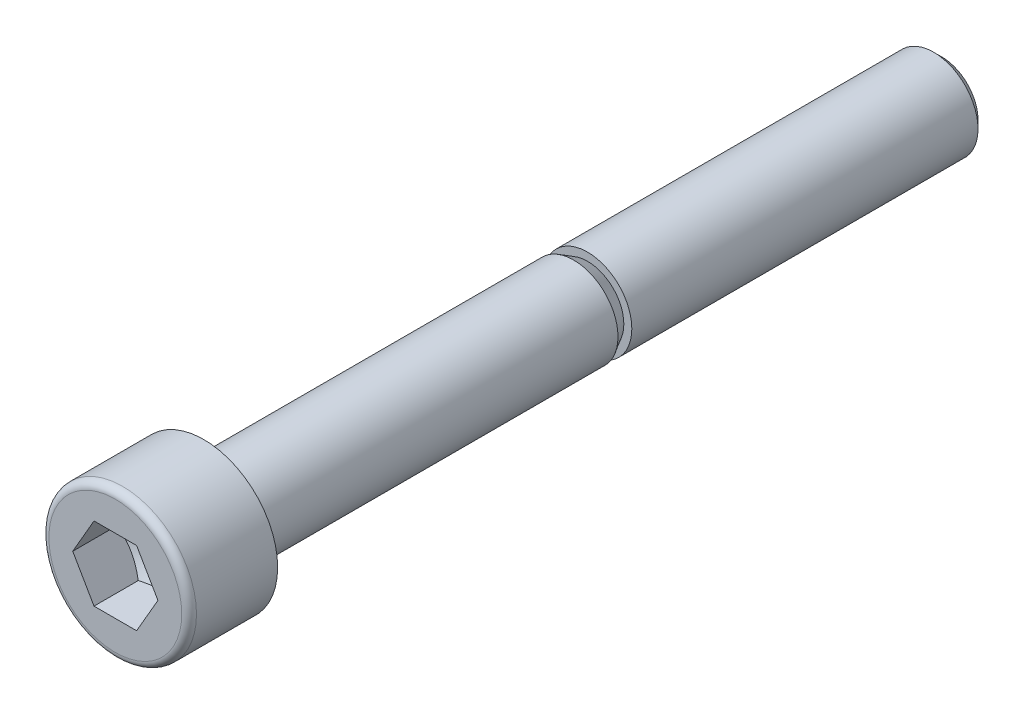
ISO-10303-21;
HEADER;
FILE_DESCRIPTION(('STEP AP214'),'2;1');
FILE_NAME('part.step','',(''),(''),'','','');
FILE_SCHEMA(('AUTOMOTIVE_DESIGN { 1 0 10303 214 1 1 1 1 }'));
ENDSEC;
DATA;
#1=APPLICATION_CONTEXT('core data for automotive mechanical design processes');
#2=APPLICATION_PROTOCOL_DEFINITION('international standard','automotive_design',2000,#1);
#3=PRODUCT_CONTEXT('',#1,'mechanical');
#4=PRODUCT('Part','Part','',(#3));
#5=PRODUCT_RELATED_PRODUCT_CATEGORY('part','',(#4));
#6=PRODUCT_DEFINITION_FORMATION('','',#4);
#7=PRODUCT_DEFINITION_CONTEXT('part definition',#1,'design');
#8=PRODUCT_DEFINITION('design','',#6,#7);
#9=PRODUCT_DEFINITION_SHAPE('','',#8);
#10=(LENGTH_UNIT() NAMED_UNIT(*) SI_UNIT(.MILLI.,.METRE.));
#11=(NAMED_UNIT(*) PLANE_ANGLE_UNIT() SI_UNIT($,.RADIAN.));
#12=(NAMED_UNIT(*) SI_UNIT($,.STERADIAN.) SOLID_ANGLE_UNIT());
#13=UNCERTAINTY_MEASURE_WITH_UNIT(LENGTH_MEASURE(1.E-05),#10,'distance_accuracy_value','');
#14=(GEOMETRIC_REPRESENTATION_CONTEXT(3) GLOBAL_UNCERTAINTY_ASSIGNED_CONTEXT((#13)) GLOBAL_UNIT_ASSIGNED_CONTEXT((#10,
#11,#12)) REPRESENTATION_CONTEXT('',''));
#15=CARTESIAN_POINT('',(0.,0.,0.));
#16=DIRECTION('',(0.,0.,1.));
#17=DIRECTION('',(1.,0.,0.));
#18=AXIS2_PLACEMENT_3D('',#15,#16,#17);
#19=CARTESIAN_POINT('',(0.,0.,6.));
#20=DIRECTION('',(0.,0.,1.));
#21=DIRECTION('',(1.,0.,0.));
#22=AXIS2_PLACEMENT_3D('',#19,#20,#21);
#23=PLANE('',#22);
#24=CARTESIAN_POINT('',(0.,0.,6.));
#25=DIRECTION('',(0.,0.,1.));
#26=DIRECTION('',(1.,0.,0.));
#27=AXIS2_PLACEMENT_3D('',#24,#25,#26);
#28=CIRCLE('',#27,4.5);
#29=CARTESIAN_POINT('',(4.5,0.,6.));
#30=VERTEX_POINT('',#29);
#31=EDGE_CURVE('E11',#30,#30,#28,.T.);
#32=ORIENTED_EDGE('',*,*,#31,.T.);
#33=EDGE_LOOP('',(#32));
#34=FACE_BOUND('',#33,.T.);
#35=DIRECTION('',(1.,0.,0.));
#36=VECTOR('',#35,1.);
#37=CARTESIAN_POINT('',(-1.443375,2.49999883437473,6.));
#38=LINE('',#37,#36);
#39=CARTESIAN_POINT('',(-1.443375,2.49999883437473,6.));
#40=VERTEX_POINT('',#39);
#41=CARTESIAN_POINT('',(1.443375,2.49999883437473,6.));
#42=VERTEX_POINT('',#41);
#43=EDGE_CURVE('E92',#40,#42,#38,.T.);
#44=ORIENTED_EDGE('',*,*,#43,.T.);
#45=DIRECTION('',(0.5,-0.866025403784439,0.));
#46=VECTOR('',#45,1.);
#47=CARTESIAN_POINT('',(1.443375,2.49999883437473,6.));
#48=LINE('',#47,#46);
#49=CARTESIAN_POINT('',(2.88675,0.,6.));
#50=VERTEX_POINT('',#49);
#51=EDGE_CURVE('E31',#42,#50,#48,.T.);
#52=ORIENTED_EDGE('',*,*,#51,.T.);
#53=DIRECTION('',(-0.5,-0.866025403784439,0.));
#54=VECTOR('',#53,1.);
#55=CARTESIAN_POINT('',(2.88675,0.,6.));
#56=LINE('',#55,#54);
#57=CARTESIAN_POINT('',(1.443375,-2.49999883437473,6.));
#58=VERTEX_POINT('',#57);
#59=EDGE_CURVE('E169',#50,#58,#56,.T.);
#60=ORIENTED_EDGE('',*,*,#59,.T.);
#61=DIRECTION('',(-1.,0.,0.));
#62=VECTOR('',#61,1.);
#63=CARTESIAN_POINT('',(1.443375,-2.49999883437473,6.));
#64=LINE('',#63,#62);
#65=CARTESIAN_POINT('',(-1.443375,-2.49999883437473,6.));
#66=VERTEX_POINT('',#65);
#67=EDGE_CURVE('E165',#58,#66,#64,.T.);
#68=ORIENTED_EDGE('',*,*,#67,.T.);
#69=DIRECTION('',(-0.5,0.866025403784439,0.));
#70=VECTOR('',#69,1.);
#71=CARTESIAN_POINT('',(-1.443375,-2.49999883437473,6.));
#72=LINE('',#71,#70);
#73=CARTESIAN_POINT('',(-2.88675,0.,6.));
#74=VERTEX_POINT('',#73);
#75=EDGE_CURVE('E160',#66,#74,#72,.T.);
#76=ORIENTED_EDGE('',*,*,#75,.T.);
#77=DIRECTION('',(0.5,0.866025403784439,0.));
#78=VECTOR('',#77,1.);
#79=CARTESIAN_POINT('',(-2.88675,0.,6.));
#80=LINE('',#79,#78);
#81=EDGE_CURVE('E96',#74,#40,#80,.T.);
#82=ORIENTED_EDGE('',*,*,#81,.T.);
#83=EDGE_LOOP('',(#44,#52,#60,#68,#76,#82));
#84=FACE_BOUND('',#83,.T.);
#85=ADVANCED_FACE('F17',(#34,#84),#23,.T.);
#86=CARTESIAN_POINT('',(0.,0.,5.5));
#87=DIRECTION('',(0.,0.,1.));
#88=DIRECTION('',(1.,0.,0.));
#89=AXIS2_PLACEMENT_3D('',#86,#87,#88);
#90=TOROIDAL_SURFACE('',#89,4.5,0.5);
#91=ORIENTED_EDGE('',*,*,#31,.F.);
#92=EDGE_LOOP('',(#91));
#93=FACE_BOUND('',#92,.T.);
#94=CARTESIAN_POINT('',(0.,0.,5.5));
#95=DIRECTION('',(0.,0.,1.));
#96=DIRECTION('',(1.,0.,0.));
#97=AXIS2_PLACEMENT_3D('',#94,#95,#96);
#98=CIRCLE('',#97,5.);
#99=CARTESIAN_POINT('',(5.,0.,5.5));
#100=VERTEX_POINT('',#99);
#101=EDGE_CURVE('E24',#100,#100,#98,.T.);
#102=ORIENTED_EDGE('',*,*,#101,.T.);
#103=EDGE_LOOP('',(#102));
#104=FACE_BOUND('',#103,.T.);
#105=ADVANCED_FACE('F133',(#93,#104),#90,.T.);
#106=CARTESIAN_POINT('',(0.,0.,6.));
#107=DIRECTION('',(0.,0.,1.));
#108=DIRECTION('',(1.,0.,0.));
#109=AXIS2_PLACEMENT_3D('',#106,#107,#108);
#110=CYLINDRICAL_SURFACE('',#109,5.);
#111=CARTESIAN_POINT('',(0.,0.,0.));
#112=DIRECTION('',(0.,0.,1.));
#113=DIRECTION('',(1.,0.,0.));
#114=AXIS2_PLACEMENT_3D('',#111,#112,#113);
#115=CIRCLE('',#114,5.);
#116=CARTESIAN_POINT('',(5.,0.,0.));
#117=VERTEX_POINT('',#116);
#118=EDGE_CURVE('E128',#117,#117,#115,.T.);
#119=ORIENTED_EDGE('',*,*,#118,.T.);
#120=EDGE_LOOP('',(#119));
#121=FACE_BOUND('',#120,.T.);
#122=ORIENTED_EDGE('',*,*,#101,.F.);
#123=EDGE_LOOP('',(#122));
#124=FACE_BOUND('',#123,.T.);
#125=ADVANCED_FACE('F135',(#121,#124),#110,.T.);
#126=CARTESIAN_POINT('',(0.,5.,0.));
#127=DIRECTION('',(0.,0.,-1.));
#128=DIRECTION('',(-1.,0.,0.));
#129=AXIS2_PLACEMENT_3D('',#126,#127,#128);
#130=PLANE('',#129);
#131=CARTESIAN_POINT('',(0.,0.,0.));
#132=DIRECTION('',(0.,0.,1.));
#133=DIRECTION('',(1.,0.,0.));
#134=AXIS2_PLACEMENT_3D('',#131,#132,#133);
#135=CIRCLE('',#134,3.3);
#136=CARTESIAN_POINT('',(3.3,0.,0.));
#137=VERTEX_POINT('',#136);
#138=EDGE_CURVE('E125',#137,#137,#135,.T.);
#139=ORIENTED_EDGE('',*,*,#138,.T.);
#140=EDGE_LOOP('',(#139));
#141=FACE_BOUND('',#140,.T.);
#142=ORIENTED_EDGE('',*,*,#118,.F.);
#143=EDGE_LOOP('',(#142));
#144=FACE_BOUND('',#143,.T.);
#145=ADVANCED_FACE('F137',(#141,#144),#130,.T.);
#146=CARTESIAN_POINT('',(0.,0.,-0.3));
#147=DIRECTION('',(0.,0.,1.));
#148=DIRECTION('',(1.,0.,0.));
#149=AXIS2_PLACEMENT_3D('',#146,#147,#148);
#150=TOROIDAL_SURFACE('',#149,3.3,0.3);
#151=CARTESIAN_POINT('',(0.,0.,-0.3));
#152=DIRECTION('',(0.,0.,1.));
#153=DIRECTION('',(1.,0.,0.));
#154=AXIS2_PLACEMENT_3D('',#151,#152,#153);
#155=CIRCLE('',#154,3.);
#156=CARTESIAN_POINT('',(3.,0.,-0.3));
#157=VERTEX_POINT('',#156);
#158=EDGE_CURVE('E122',#157,#157,#155,.T.);
#159=ORIENTED_EDGE('',*,*,#158,.T.);
#160=EDGE_LOOP('',(#159));
#161=FACE_BOUND('',#160,.T.);
#162=ORIENTED_EDGE('',*,*,#138,.F.);
#163=EDGE_LOOP('',(#162));
#164=FACE_BOUND('',#163,.T.);
#165=ADVANCED_FACE('F145',(#161,#164),#150,.F.);
#166=CARTESIAN_POINT('',(0.,0.,6.));
#167=DIRECTION('',(0.,0.,1.));
#168=DIRECTION('',(1.,0.,0.));
#169=AXIS2_PLACEMENT_3D('',#166,#167,#168);
#170=CYLINDRICAL_SURFACE('',#169,3.);
#171=CARTESIAN_POINT('',(0.,0.,-25.0625275004034));
#172=DIRECTION('',(0.,0.,1.));
#173=DIRECTION('',(1.,0.,0.));
#174=AXIS2_PLACEMENT_3D('',#171,#172,#173);
#175=CIRCLE('',#174,3.);
#176=CARTESIAN_POINT('',(3.,0.,-25.0625275004034));
#177=VERTEX_POINT('',#176);
#178=EDGE_CURVE('E119',#177,#177,#175,.T.);
#179=ORIENTED_EDGE('',*,*,#178,.T.);
#180=EDGE_LOOP('',(#179));
#181=FACE_BOUND('',#180,.T.);
#182=ORIENTED_EDGE('',*,*,#158,.F.);
#183=EDGE_LOOP('',(#182));
#184=FACE_BOUND('',#183,.T.);
#185=ADVANCED_FACE('F346',(#181,#184),#170,.T.);
#186=CARTESIAN_POINT('',(0.,0.,-25.0625275004034));
#187=DIRECTION('',(0.,0.,1.));
#188=DIRECTION('',(1.,0.,0.));
#189=AXIS2_PLACEMENT_3D('',#186,#187,#188);
#190=CONICAL_SURFACE('',#189,3.,0.523598775598299);
#191=CARTESIAN_POINT('',(0.,0.,-26.));
#192=DIRECTION('',(0.,0.,1.));
#193=DIRECTION('',(1.,0.,0.));
#194=AXIS2_PLACEMENT_3D('',#191,#192,#193);
#195=CIRCLE('',#194,2.45875);
#196=CARTESIAN_POINT('',(2.45875,0.,-26.));
#197=VERTEX_POINT('',#196);
#198=EDGE_CURVE('E116',#197,#197,#195,.T.);
#199=ORIENTED_EDGE('',*,*,#198,.T.);
#200=EDGE_LOOP('',(#199));
#201=FACE_BOUND('',#200,.T.);
#202=ORIENTED_EDGE('',*,*,#178,.F.);
#203=EDGE_LOOP('',(#202));
#204=FACE_BOUND('',#203,.T.);
#205=ADVANCED_FACE('F337',(#201,#204),#190,.T.);
#206=CARTESIAN_POINT('',(0.,2.45875,-26.));
#207=DIRECTION('',(0.,0.,1.));
#208=DIRECTION('',(1.,0.,0.));
#209=AXIS2_PLACEMENT_3D('',#206,#207,#208);
#210=PLANE('',#209);
#211=CARTESIAN_POINT('',(0.,0.,-26.));
#212=DIRECTION('',(0.,0.,1.));
#213=DIRECTION('',(1.,0.,0.));
#214=AXIS2_PLACEMENT_3D('',#211,#212,#213);
#215=CIRCLE('',#214,3.);
#216=CARTESIAN_POINT('',(3.,0.,-26.));
#217=VERTEX_POINT('',#216);
#218=EDGE_CURVE('E113',#217,#217,#215,.T.);
#219=ORIENTED_EDGE('',*,*,#218,.T.);
#220=EDGE_LOOP('',(#219));
#221=FACE_BOUND('',#220,.T.);
#222=ORIENTED_EDGE('',*,*,#198,.F.);
#223=EDGE_LOOP('',(#222));
#224=FACE_BOUND('',#223,.T.);
#225=ADVANCED_FACE('F322',(#221,#224),#210,.T.);
#226=CARTESIAN_POINT('',(0.,0.,6.));
#227=DIRECTION('',(0.,0.,1.));
#228=DIRECTION('',(1.,0.,0.));
#229=AXIS2_PLACEMENT_3D('',#226,#227,#228);
#230=CYLINDRICAL_SURFACE('',#229,3.);
#231=CARTESIAN_POINT('',(0.,0.,-49.45875));
#232=DIRECTION('',(0.,0.,1.));
#233=DIRECTION('',(1.,0.,0.));
#234=AXIS2_PLACEMENT_3D('',#231,#232,#233);
#235=CIRCLE('',#234,3.);
#236=CARTESIAN_POINT('',(3.,0.,-49.45875));
#237=VERTEX_POINT('',#236);
#238=EDGE_CURVE('E110',#237,#237,#235,.T.);
#239=ORIENTED_EDGE('',*,*,#238,.T.);
#240=EDGE_LOOP('',(#239));
#241=FACE_BOUND('',#240,.T.);
#242=ORIENTED_EDGE('',*,*,#218,.F.);
#243=EDGE_LOOP('',(#242));
#244=FACE_BOUND('',#243,.T.);
#245=ADVANCED_FACE('F311',(#241,#244),#230,.T.);
#246=CARTESIAN_POINT('',(0.,0.,-49.45875));
#247=DIRECTION('',(0.,0.,1.));
#248=DIRECTION('',(1.,0.,0.));
#249=AXIS2_PLACEMENT_3D('',#246,#247,#248);
#250=CONICAL_SURFACE('',#249,3.,0.78539816339745);
#251=CARTESIAN_POINT('',(0.,0.,-50.));
#252=DIRECTION('',(0.,0.,1.));
#253=DIRECTION('',(1.,0.,0.));
#254=AXIS2_PLACEMENT_3D('',#251,#252,#253);
#255=CIRCLE('',#254,2.45875);
#256=CARTESIAN_POINT('',(2.45875,0.,-50.));
#257=VERTEX_POINT('',#256);
#258=EDGE_CURVE('E107',#257,#257,#255,.T.);
#259=ORIENTED_EDGE('',*,*,#258,.T.);
#260=EDGE_LOOP('',(#259));
#261=FACE_BOUND('',#260,.T.);
#262=ORIENTED_EDGE('',*,*,#238,.F.);
#263=EDGE_LOOP('',(#262));
#264=FACE_BOUND('',#263,.T.);
#265=ADVANCED_FACE('F303',(#261,#264),#250,.T.);
#266=CARTESIAN_POINT('',(0.,2.45875,-50.));
#267=DIRECTION('',(0.,0.,-1.));
#268=DIRECTION('',(-1.,0.,0.));
#269=AXIS2_PLACEMENT_3D('',#266,#267,#268);
#270=PLANE('',#269);
#271=ORIENTED_EDGE('',*,*,#258,.F.);
#272=EDGE_LOOP('',(#271));
#273=FACE_BOUND('',#272,.T.);
#274=ADVANCED_FACE('F225',(#273),#270,.T.);
#275=CARTESIAN_POINT('',(1.443375,2.49999883437473,1.33333411041685));
#276=DIRECTION('',(-0.866025403784439,-0.5,0.));
#277=DIRECTION('',(-0.5,0.866025403784439,0.));
#278=AXIS2_PLACEMENT_3D('',#275,#276,#277);
#279=PLANE('',#278);
#280=DIRECTION('',(0.,0.,1.));
#281=VECTOR('',#280,1.);
#282=CARTESIAN_POINT('',(2.88675,0.,1.33333411041685));
#283=LINE('',#282,#281);
#284=CARTESIAN_POINT('',(2.88675,0.,3.));
#285=VERTEX_POINT('',#284);
#286=EDGE_CURVE('E105',#285,#50,#283,.T.);
#287=ORIENTED_EDGE('',*,*,#286,.T.);
#288=ORIENTED_EDGE('',*,*,#51,.F.);
#289=DIRECTION('',(0.,0.,1.));
#290=VECTOR('',#289,1.);
#291=CARTESIAN_POINT('',(1.443375,2.49999883437473,1.33333411041685));
#292=LINE('',#291,#290);
#293=CARTESIAN_POINT('',(1.443375,2.49999883437473,3.));
#294=VERTEX_POINT('',#293);
#295=EDGE_CURVE('E86',#294,#42,#292,.T.);
#296=ORIENTED_EDGE('',*,*,#295,.F.);
#297=CARTESIAN_POINT('',(2.88675011547006,-1.99999999863357E-07,3.00000006666667));
#298=CARTESIAN_POINT('',(2.82332252366581,0.10985961160669,2.96336950967828));
#299=CARTESIAN_POINT('',(2.75934742579574,0.220667731536841,2.93005593436152));
#300=CARTESIAN_POINT('',(2.63028954387127,0.444202540147256,2.87190808727666));
#301=CARTESIAN_POINT('',(2.56520446745334,0.556933199317605,2.84709438377072));
#302=CARTESIAN_POINT('',(2.43584088140159,0.780997503008549,2.80847006268835));
#303=CARTESIAN_POINT('',(2.37158227044588,0.892296682007636,2.7944023489199));
#304=CARTESIAN_POINT('',(2.24276284805613,1.11541846658835,2.77761157054617));
#305=CARTESIAN_POINT('',(2.17820250452486,1.22724026173863,2.77487459839365));
#306=CARTESIAN_POINT('',(2.05757841328359,1.43616731638533,2.78058295689796));
#307=CARTESIAN_POINT('',(2.00149656500914,1.53330392697905,2.7876266963322));
#308=CARTESIAN_POINT('',(1.8896982234341,1.72694433478895,2.80994670830941));
#309=CARTESIAN_POINT('',(1.83398211652594,1.82344746275382,2.82523059787334));
#310=CARTESIAN_POINT('',(1.72195345954662,2.01748678854571,2.86343736615338));
#311=CARTESIAN_POINT('',(1.66565508107193,2.11499844044762,2.88652212541071));
#312=CARTESIAN_POINT('',(1.55389777191142,2.3085677780308,2.93891477048972));
#313=CARTESIAN_POINT('',(1.49843741058811,2.40462794164891,2.96821035401504));
#314=CARTESIAN_POINT('',(1.44337488452994,2.49999903437473,3.00000006666667));
#315=B_SPLINE_CURVE_WITH_KNOTS('',3,(#297,#298,#299,#300,#301,#302,#303,#304,#305,#306,#307,
#308,#309,#310,#311,#312,#313,#314),.UNSPECIFIED.,.F.,.F.,(4,2,2,2,2,2,2,2,4),(0.,
0.396269845497158,0.793491933375094,1.18088400346178,1.56780044062153,1.90463400294076,
2.24177946228527,2.58640119548574,2.93034658115087),.UNSPECIFIED.);
#316=EDGE_CURVE('E79',#285,#294,#315,.T.);
#317=ORIENTED_EDGE('',*,*,#316,.F.);
#318=EDGE_LOOP('',(#287,#288,#296,#317));
#319=FACE_BOUND('',#318,.T.);
#320=ADVANCED_FACE('F87',(#319),#279,.T.);
#321=CARTESIAN_POINT('',(2.88675,0.,1.33333411041685));
#322=DIRECTION('',(-0.866025403784439,0.5,0.));
#323=DIRECTION('',(0.5,0.866025403784439,0.));
#324=AXIS2_PLACEMENT_3D('',#321,#322,#323);
#325=PLANE('',#324);
#326=DIRECTION('',(0.,0.,1.));
#327=VECTOR('',#326,1.);
#328=CARTESIAN_POINT('',(1.443375,-2.49999883437473,1.33333411041685));
#329=LINE('',#328,#327);
#330=CARTESIAN_POINT('',(1.443375,-2.49999883437473,3.));
#331=VERTEX_POINT('',#330);
#332=EDGE_CURVE('E103',#331,#58,#329,.T.);
#333=ORIENTED_EDGE('',*,*,#332,.T.);
#334=ORIENTED_EDGE('',*,*,#59,.F.);
#335=ORIENTED_EDGE('',*,*,#286,.F.);
#336=CARTESIAN_POINT('',(1.44337488452995,-2.49999903437473,3.00000006666667));
#337=CARTESIAN_POINT('',(1.50680247633419,-2.39013922276804,2.96336950967828));
#338=CARTESIAN_POINT('',(1.57077757420426,-2.27933110283789,2.93005593436152));
#339=CARTESIAN_POINT('',(1.69983545612873,-2.05579629422747,2.87190808727666));
#340=CARTESIAN_POINT('',(1.76492053254666,-1.94306563505712,2.84709438377072));
#341=CARTESIAN_POINT('',(1.89428411859841,-1.71900133136618,2.80847006268835));
#342=CARTESIAN_POINT('',(1.95854272955412,-1.60770215236709,2.7944023489199));
#343=CARTESIAN_POINT('',(2.08736215194387,-1.38458036778637,2.77761157054617));
#344=CARTESIAN_POINT('',(2.15192249547514,-1.2727585726361,2.77487459839365));
#345=CARTESIAN_POINT('',(2.27254658671641,-1.06383151798939,2.78058295689796));
#346=CARTESIAN_POINT('',(2.32862843499086,-0.96669490739568,2.7876266963322));
#347=CARTESIAN_POINT('',(2.4404267765659,-0.773054499585779,2.8099467083094));
#348=CARTESIAN_POINT('',(2.49614288347406,-0.676551371620907,2.82523059787334));
#349=CARTESIAN_POINT('',(2.60817154045338,-0.48251204582902,2.86343736615338));
#350=CARTESIAN_POINT('',(2.66446991892807,-0.385000393927105,2.88652212541071));
#351=CARTESIAN_POINT('',(2.77622722808858,-0.191431056343928,2.93891477048972));
#352=CARTESIAN_POINT('',(2.83168758941189,-0.0953708927258217,2.96821035401504));
#353=CARTESIAN_POINT('',(2.88675011547006,1.99999999976406E-07,3.00000006666667));
#354=B_SPLINE_CURVE_WITH_KNOTS('',3,(#336,#337,#338,#339,#340,#341,#342,#343,#344,#345,#346,
#347,#348,#349,#350,#351,#352,#353),.UNSPECIFIED.,.F.,.F.,(4,2,2,2,2,2,2,2,4),(0.,
0.396269845497159,0.793491933375095,1.18088400346178,1.56780044062153,1.90463400294076,
2.24177946228527,2.58640119548574,2.93034658115087),.UNSPECIFIED.);
#355=EDGE_CURVE('E83',#331,#285,#354,.T.);
#356=ORIENTED_EDGE('',*,*,#355,.F.);
#357=EDGE_LOOP('',(#333,#334,#335,#356));
#358=FACE_BOUND('',#357,.T.);
#359=ADVANCED_FACE('F216',(#358),#325,.T.);
#360=CARTESIAN_POINT('',(1.443375,-2.49999883437473,1.33333411041685));
#361=DIRECTION('',(0.,1.,0.));
#362=DIRECTION('',(1.,0.,0.));
#363=AXIS2_PLACEMENT_3D('',#360,#361,#362);
#364=PLANE('',#363);
#365=DIRECTION('',(0.,0.,1.));
#366=VECTOR('',#365,1.);
#367=CARTESIAN_POINT('',(-1.443375,-2.49999883437473,1.33333411041685));
#368=LINE('',#367,#366);
#369=CARTESIAN_POINT('',(-1.443375,-2.49999883437473,3.));
#370=VERTEX_POINT('',#369);
#371=EDGE_CURVE('E101',#370,#66,#368,.T.);
#372=ORIENTED_EDGE('',*,*,#371,.T.);
#373=ORIENTED_EDGE('',*,*,#67,.F.);
#374=ORIENTED_EDGE('',*,*,#332,.F.);
#375=CARTESIAN_POINT('',(-3.73786106214978,-2.49999883437473,3.92958778907324));
#376=CARTESIAN_POINT('',(-3.62896491195938,-2.49999883437473,3.87734398831161));
#377=CARTESIAN_POINT('',(-3.51980131110672,-2.49999883437473,3.82564701620672));
#378=CARTESIAN_POINT('',(-3.30079453275696,-2.49999883437473,3.72366066581967));
#379=CARTESIAN_POINT('',(-3.19095123199839,-2.49999883437473,3.67337155256083));
#380=CARTESIAN_POINT('',(-2.96980741137606,-2.49999883437473,3.57423266172552));
#381=CARTESIAN_POINT('',(-2.85850208851781,-2.49999883437473,3.5253935570836));
#382=CARTESIAN_POINT('',(-2.63494533066189,-2.49999883437473,3.42993961665011));
#383=CARTESIAN_POINT('',(-2.52269394848717,-2.49999883437473,3.38332465762953));
#384=CARTESIAN_POINT('',(-2.2960796228752,-2.49999883437473,3.29252281771904));
#385=CARTESIAN_POINT('',(-2.18170681392527,-2.49999883437473,3.2483604168365));
#386=CARTESIAN_POINT('',(-1.95158478593381,-2.49999883437473,3.16370836718421));
#387=CARTESIAN_POINT('',(-1.83583541308941,-2.49999883437473,3.12321913326025));
#388=CARTESIAN_POINT('',(-1.60304799958039,-2.49999883437473,3.04706130714345));
#389=CARTESIAN_POINT('',(-1.4860136544433,-2.49999883437473,3.01138153954989));
#390=CARTESIAN_POINT('',(-1.25028155584969,-2.49999883437473,2.94604587235114));
#391=CARTESIAN_POINT('',(-1.13158421230429,-2.49999883437473,2.91638851527048));
#392=CARTESIAN_POINT('',(-0.892146141983619,-2.49999883437473,2.86451911091829));
#393=CARTESIAN_POINT('',(-0.771400115486069,-2.49999883437473,2.84233105195638));
#394=CARTESIAN_POINT('',(-0.528550538126974,-2.49999883437473,2.8070567548414));
#395=CARTESIAN_POINT('',(-0.406446967923683,-2.49999883437473,2.7939706465386));
#396=CARTESIAN_POINT('',(-0.162227421037293,-2.49999883437473,2.77805851853028));
#397=CARTESIAN_POINT('',(-0.0401151733531879,-2.49999883437473,2.77517671003708));
#398=CARTESIAN_POINT('',(0.203885891243259,-2.49999883437473,2.77978959871521));
#399=CARTESIAN_POINT('',(0.325774751512606,-2.49999883437473,2.78728200631532));
#400=CARTESIAN_POINT('',(0.536617165080476,-2.49999883437473,2.80870547357712));
#401=CARTESIAN_POINT('',(0.625806204585235,-2.49999883437473,2.82042640123085));
#402=CARTESIAN_POINT('',(0.803437024790562,-2.49999883437473,2.84861382064688));
#403=CARTESIAN_POINT('',(0.891878680031716,-2.49999883437473,2.86508109348135));
#404=CARTESIAN_POINT('',(1.1562492807378,-2.49999883437473,2.92077504184743));
#405=CARTESIAN_POINT('',(1.3308708069745,-2.49999883437473,2.96625356320288));
#406=CARTESIAN_POINT('',(1.59190160301469,-2.49999883437473,3.04393162478608));
#407=CARTESIAN_POINT('',(1.67969059973094,-2.49999883437473,3.0717495689676));
#408=CARTESIAN_POINT('',(1.85442096143946,-2.49999883437473,3.12997740734101));
#409=CARTESIAN_POINT('',(1.94136225311569,-2.49999883437473,3.16038752354637));
#410=CARTESIAN_POINT('',(2.1139610250156,-2.49999883437473,3.22316216485984));
#411=CARTESIAN_POINT('',(2.19962301770649,-2.49999883437473,3.25551440549188));
#412=CARTESIAN_POINT('',(2.37023194830679,-2.49999883437473,3.32197432045096));
#413=CARTESIAN_POINT('',(2.45517911361762,-2.49999883437473,3.35608140990558));
#414=CARTESIAN_POINT('',(2.53982745281954,-2.49999883437473,3.3908988248281));
#415=B_SPLINE_CURVE_WITH_KNOTS('',3,(#375,#376,#377,#378,#379,#380,#381,#382,#383,#384,#385,
#386,#387,#388,#389,#390,#391,#392,#393,#394,#395,#396,#397,#398,#399,#400,#401,#402,#403,#404,
#405,#406,#407,#408,#409,#410,#411,#412,#413,#414),.UNSPECIFIED.,.F.,.F.,(4,2,2,2,2,2,2,2,2,2,2,
2,2,2,2,2,2,2,2,4),(0.,0.362345077461351,0.724757912306451,1.08938530048732,1.45399246293536,
1.82175226930555,2.18955355872751,2.55648491480033,2.92332736420018,3.29133696448628,
3.65935181476395,4.02535152666688,4.39127047595122,4.66100477488141,4.93078348742953,
5.47140222651042,5.74765583222639,6.02393312223645,6.29861688003657,6.57320967433308),.UNSPECIFIED.);
#416=EDGE_CURVE('E207',#370,#331,#415,.T.);
#417=ORIENTED_EDGE('',*,*,#416,.F.);
#418=EDGE_LOOP('',(#372,#373,#374,#417));
#419=FACE_BOUND('',#418,.T.);
#420=ADVANCED_FACE('F212',(#419),#364,.T.);
#421=CARTESIAN_POINT('',(-1.443375,-2.49999883437473,1.33333411041685));
#422=DIRECTION('',(0.866025403784439,0.5,0.));
#423=DIRECTION('',(0.5,-0.866025403784439,0.));
#424=AXIS2_PLACEMENT_3D('',#421,#422,#423);
#425=PLANE('',#424);
#426=DIRECTION('',(0.,0.,1.));
#427=VECTOR('',#426,1.);
#428=CARTESIAN_POINT('',(-2.88675,0.,1.33333411041685));
#429=LINE('',#428,#427);
#430=CARTESIAN_POINT('',(-2.88675,0.,3.));
#431=VERTEX_POINT('',#430);
#432=EDGE_CURVE('E94',#431,#74,#429,.T.);
#433=ORIENTED_EDGE('',*,*,#432,.T.);
#434=ORIENTED_EDGE('',*,*,#75,.F.);
#435=ORIENTED_EDGE('',*,*,#371,.F.);
#436=CARTESIAN_POINT('',(-2.88675011547006,2.E-07,3.00000006666667));
#437=CARTESIAN_POINT('',(-2.82332252366581,-0.109859611606689,2.96336950967828));
#438=CARTESIAN_POINT('',(-2.75934742579574,-0.220667731536841,2.93005593436152));
#439=CARTESIAN_POINT('',(-2.63028954387127,-0.444202540147256,2.87190808727666));
#440=CARTESIAN_POINT('',(-2.56520446745334,-0.556933199317605,2.84709438377072));
#441=CARTESIAN_POINT('',(-2.43584088140159,-0.78099750300855,2.80847006268835));
#442=CARTESIAN_POINT('',(-2.37158227044588,-0.892296682007636,2.7944023489199));
#443=CARTESIAN_POINT('',(-2.24276284805613,-1.11541846658835,2.77761157054617));
#444=CARTESIAN_POINT('',(-2.17820250452486,-1.22724026173863,2.77487459839365));
#445=CARTESIAN_POINT('',(-2.05757841328359,-1.43616731638533,2.78058295689796));
#446=CARTESIAN_POINT('',(-2.00149656500914,-1.53330392697905,2.7876266963322));
#447=CARTESIAN_POINT('',(-1.8896982234341,-1.72694433478895,2.80994670830941));
#448=CARTESIAN_POINT('',(-1.83398211652594,-1.82344746275382,2.82523059787334));
#449=CARTESIAN_POINT('',(-1.72195345954662,-2.01748678854571,2.86343736615338));
#450=CARTESIAN_POINT('',(-1.66565508107193,-2.11499844044762,2.88652212541071));
#451=CARTESIAN_POINT('',(-1.55389777191142,-2.3085677780308,2.93891477048972));
#452=CARTESIAN_POINT('',(-1.49843741058811,-2.40462794164891,2.96821035401504));
#453=CARTESIAN_POINT('',(-1.44337488452995,-2.49999903437473,3.00000006666667));
#454=B_SPLINE_CURVE_WITH_KNOTS('',3,(#436,#437,#438,#439,#440,#441,#442,#443,#444,#445,#446,
#447,#448,#449,#450,#451,#452,#453),.UNSPECIFIED.,.F.,.F.,(4,2,2,2,2,2,2,2,4),(0.,
0.396269845497158,0.793491933375094,1.18088400346178,1.56780044062153,1.90463400294076,
2.24177946228527,2.58640119548574,2.93034658115087),.UNSPECIFIED.);
#455=EDGE_CURVE('E202',#431,#370,#454,.T.);
#456=ORIENTED_EDGE('',*,*,#455,.F.);
#457=EDGE_LOOP('',(#433,#434,#435,#456));
#458=FACE_BOUND('',#457,.T.);
#459=ADVANCED_FACE('F215',(#458),#425,.T.);
#460=CARTESIAN_POINT('',(-2.88675,0.,1.33333411041685));
#461=DIRECTION('',(0.866025403784439,-0.5,0.));
#462=DIRECTION('',(-0.5,-0.866025403784439,0.));
#463=AXIS2_PLACEMENT_3D('',#460,#461,#462);
#464=PLANE('',#463);
#465=DIRECTION('',(0.,0.,1.));
#466=VECTOR('',#465,1.);
#467=CARTESIAN_POINT('',(-1.443375,2.49999883437473,1.33333411041685));
#468=LINE('',#467,#466);
#469=CARTESIAN_POINT('',(-1.443375,2.49999883437473,3.));
#470=VERTEX_POINT('',#469);
#471=EDGE_CURVE('E91',#470,#40,#468,.T.);
#472=ORIENTED_EDGE('',*,*,#471,.T.);
#473=ORIENTED_EDGE('',*,*,#81,.F.);
#474=ORIENTED_EDGE('',*,*,#432,.F.);
#475=CARTESIAN_POINT('',(-1.44337488452995,2.49999903437473,3.00000006666667));
#476=CARTESIAN_POINT('',(-1.50680247633419,2.39013922276804,2.96336950967828));
#477=CARTESIAN_POINT('',(-1.57077757420426,2.27933110283789,2.93005593436152));
#478=CARTESIAN_POINT('',(-1.69983545612874,2.05579629422747,2.87190808727665));
#479=CARTESIAN_POINT('',(-1.76492053254666,1.94306563505712,2.84709438377072));
#480=CARTESIAN_POINT('',(-1.89428411859841,1.71900133136618,2.80847006268835));
#481=CARTESIAN_POINT('',(-1.95854272955412,1.60770215236709,2.7944023489199));
#482=CARTESIAN_POINT('',(-2.08736215194387,1.38458036778637,2.77761157054617));
#483=CARTESIAN_POINT('',(-2.15192249547514,1.2727585726361,2.77487459839365));
#484=CARTESIAN_POINT('',(-2.27254658671641,1.06383151798939,2.78058295689796));
#485=CARTESIAN_POINT('',(-2.32862843499086,0.966694907395678,2.7876266963322));
#486=CARTESIAN_POINT('',(-2.4404267765659,0.773054499585779,2.8099467083094));
#487=CARTESIAN_POINT('',(-2.49614288347406,0.676551371620906,2.82523059787334));
#488=CARTESIAN_POINT('',(-2.60817154045338,0.48251204582902,2.86343736615338));
#489=CARTESIAN_POINT('',(-2.66446991892807,0.385000393927105,2.88652212541071));
#490=CARTESIAN_POINT('',(-2.77622722808858,0.191431056343928,2.93891477048972));
#491=CARTESIAN_POINT('',(-2.83168758941189,0.0953708927258217,2.96821035401504));
#492=CARTESIAN_POINT('',(-2.88675011547006,-2.00000000044562E-07,3.00000006666667));
#493=B_SPLINE_CURVE_WITH_KNOTS('',3,(#475,#476,#477,#478,#479,#480,#481,#482,#483,#484,#485,
#486,#487,#488,#489,#490,#491,#492),.UNSPECIFIED.,.F.,.F.,(4,2,2,2,2,2,2,2,4),(0.,
0.396269845497157,0.793491933375093,1.18088400346178,1.56780044062153,1.90463400294076,
2.24177946228527,2.58640119548574,2.93034658115087),.UNSPECIFIED.);
#494=EDGE_CURVE('E39',#470,#431,#493,.T.);
#495=ORIENTED_EDGE('',*,*,#494,.F.);
#496=EDGE_LOOP('',(#472,#473,#474,#495));
#497=FACE_BOUND('',#496,.T.);
#498=ADVANCED_FACE('F159',(#497),#464,.T.);
#499=CARTESIAN_POINT('',(-1.443375,2.49999883437473,1.33333411041685));
#500=DIRECTION('',(0.,-1.,0.));
#501=DIRECTION('',(-1.,0.,0.));
#502=AXIS2_PLACEMENT_3D('',#499,#500,#501);
#503=PLANE('',#502);
#504=ORIENTED_EDGE('',*,*,#295,.T.);
#505=ORIENTED_EDGE('',*,*,#43,.F.);
#506=ORIENTED_EDGE('',*,*,#471,.F.);
#507=CARTESIAN_POINT('',(-3.73786106214979,2.49999883437473,3.92958778907324));
#508=CARTESIAN_POINT('',(-3.62896491195938,2.49999883437473,3.87734398831161));
#509=CARTESIAN_POINT('',(-3.51980131110672,2.49999883437473,3.82564701620672));
#510=CARTESIAN_POINT('',(-3.30079453275696,2.49999883437473,3.72366066581967));
#511=CARTESIAN_POINT('',(-3.1909512319984,2.49999883437473,3.67337155256083));
#512=CARTESIAN_POINT('',(-2.96980741137607,2.49999883437473,3.57423266172552));
#513=CARTESIAN_POINT('',(-2.85850208851781,2.49999883437473,3.5253935570836));
#514=CARTESIAN_POINT('',(-2.6349453306619,2.49999883437473,3.42993961665011));
#515=CARTESIAN_POINT('',(-2.52269394848718,2.49999883437473,3.38332465762953));
#516=CARTESIAN_POINT('',(-2.2960796228752,2.49999883437473,3.29252281771904));
#517=CARTESIAN_POINT('',(-2.18170681392528,2.49999883437473,3.2483604168365));
#518=CARTESIAN_POINT('',(-1.95158478593381,2.49999883437473,3.16370836718421));
#519=CARTESIAN_POINT('',(-1.83583541308942,2.49999883437473,3.12321913326026));
#520=CARTESIAN_POINT('',(-1.60304799958039,2.49999883437473,3.04706130714345));
#521=CARTESIAN_POINT('',(-1.4860136544433,2.49999883437473,3.01138153954989));
#522=CARTESIAN_POINT('',(-1.2502815558497,2.49999883437473,2.94604587235114));
#523=CARTESIAN_POINT('',(-1.1315842123043,2.49999883437473,2.91638851527048));
#524=CARTESIAN_POINT('',(-0.892146141983622,2.49999883437473,2.86451911091829));
#525=CARTESIAN_POINT('',(-0.771400115486072,2.49999883437473,2.84233105195638));
#526=CARTESIAN_POINT('',(-0.528550538126977,2.49999883437473,2.8070567548414));
#527=CARTESIAN_POINT('',(-0.406446967923686,2.49999883437473,2.7939706465386));
#528=CARTESIAN_POINT('',(-0.162227421037296,2.49999883437473,2.77805851853028));
#529=CARTESIAN_POINT('',(-0.0401151733531905,2.49999883437473,2.77517671003708));
#530=CARTESIAN_POINT('',(0.203885891243256,2.49999883437473,2.77978959871521));
#531=CARTESIAN_POINT('',(0.325774751512604,2.49999883437473,2.78728200631532));
#532=CARTESIAN_POINT('',(0.536617165080473,2.49999883437473,2.80870547357712));
#533=CARTESIAN_POINT('',(0.625806204585233,2.49999883437473,2.82042640123085));
#534=CARTESIAN_POINT('',(0.80343702479056,2.49999883437473,2.84861382064688));
#535=CARTESIAN_POINT('',(0.891878680031713,2.49999883437473,2.86508109348135));
#536=CARTESIAN_POINT('',(1.1562492807378,2.49999883437473,2.92077504184743));
#537=CARTESIAN_POINT('',(1.3308708069745,2.49999883437473,2.96625356320288));
#538=CARTESIAN_POINT('',(1.59190160301469,2.49999883437473,3.04393162478608));
#539=CARTESIAN_POINT('',(1.67969059973094,2.49999883437473,3.0717495689676));
#540=CARTESIAN_POINT('',(1.85442096143945,2.49999883437473,3.12997740734101));
#541=CARTESIAN_POINT('',(1.94136225311568,2.49999883437473,3.16038752354637));
#542=CARTESIAN_POINT('',(2.1139610250156,2.49999883437473,3.22316216485984));
#543=CARTESIAN_POINT('',(2.19962301770648,2.49999883437473,3.25551440549188));
#544=CARTESIAN_POINT('',(2.37023194830679,2.49999883437473,3.32197432045096));
#545=CARTESIAN_POINT('',(2.45517911361761,2.49999883437473,3.35608140990557));
#546=CARTESIAN_POINT('',(2.53982745281954,2.49999883437473,3.3908988248281));
#547=B_SPLINE_CURVE_WITH_KNOTS('',3,(#507,#508,#509,#510,#511,#512,#513,#514,#515,#516,#517,
#518,#519,#520,#521,#522,#523,#524,#525,#526,#527,#528,#529,#530,#531,#532,#533,#534,#535,#536,
#537,#538,#539,#540,#541,#542,#543,#544,#545,#546),.UNSPECIFIED.,.F.,.F.,(4,2,2,2,2,2,2,2,2,2,2,
2,2,2,2,2,2,2,2,4),(0.,0.36234507746135,0.724757912306449,1.08938530048732,1.45399246293535,
1.82175226930555,2.18955355872751,2.55648491480033,2.92332736420018,3.29133696448628,
3.65935181476395,4.02535152666688,4.39127047595122,4.66100477488141,4.93078348742953,
5.47140222651042,5.74765583222639,6.02393312223645,6.29861688003657,6.57320967433308),.UNSPECIFIED.);
#548=EDGE_CURVE('E80',#294,#470,#547,.F.);
#549=ORIENTED_EDGE('',*,*,#548,.F.);
#550=EDGE_LOOP('',(#504,#505,#506,#549));
#551=FACE_BOUND('',#550,.T.);
#552=ADVANCED_FACE('F75',(#551),#503,.T.);
#553=CARTESIAN_POINT('',(0.,0.,1.33333411041685));
#554=DIRECTION('',(0.,0.,1.));
#555=DIRECTION('',(1.,0.,0.));
#556=AXIS2_PLACEMENT_3D('',#553,#554,#555);
#557=CONICAL_SURFACE('',#556,0.,1.0471975511966);
#558=CARTESIAN_POINT('',(0.,0.,1.33333411041685));
#559=VERTEX_POINT('',#558);
#560=VERTEX_LOOP('',#559);
#561=FACE_BOUND('',#560,.T.);
#562=ORIENTED_EDGE('',*,*,#316,.T.);
#563=ORIENTED_EDGE('',*,*,#548,.T.);
#564=ORIENTED_EDGE('',*,*,#494,.T.);
#565=ORIENTED_EDGE('',*,*,#455,.T.);
#566=ORIENTED_EDGE('',*,*,#416,.T.);
#567=ORIENTED_EDGE('',*,*,#355,.T.);
#568=EDGE_LOOP('',(#562,#563,#564,#565,#566,#567));
#569=FACE_BOUND('',#568,.T.);
#570=ADVANCED_FACE('F72',(#561,#569),#557,.F.);
#571=CLOSED_SHELL('',(#85,#105,#125,#145,#165,#185,#205,#225,#245,#265,#274,#320,#359,#420,#459,
#498,#552,#570));
#572=MANIFOLD_SOLID_BREP('B1',#571);
#573=ADVANCED_BREP_SHAPE_REPRESENTATION('',(#18,#572),#14);
#574=SHAPE_DEFINITION_REPRESENTATION(#9,#573);
ENDSEC;
END-ISO-10303-21;
